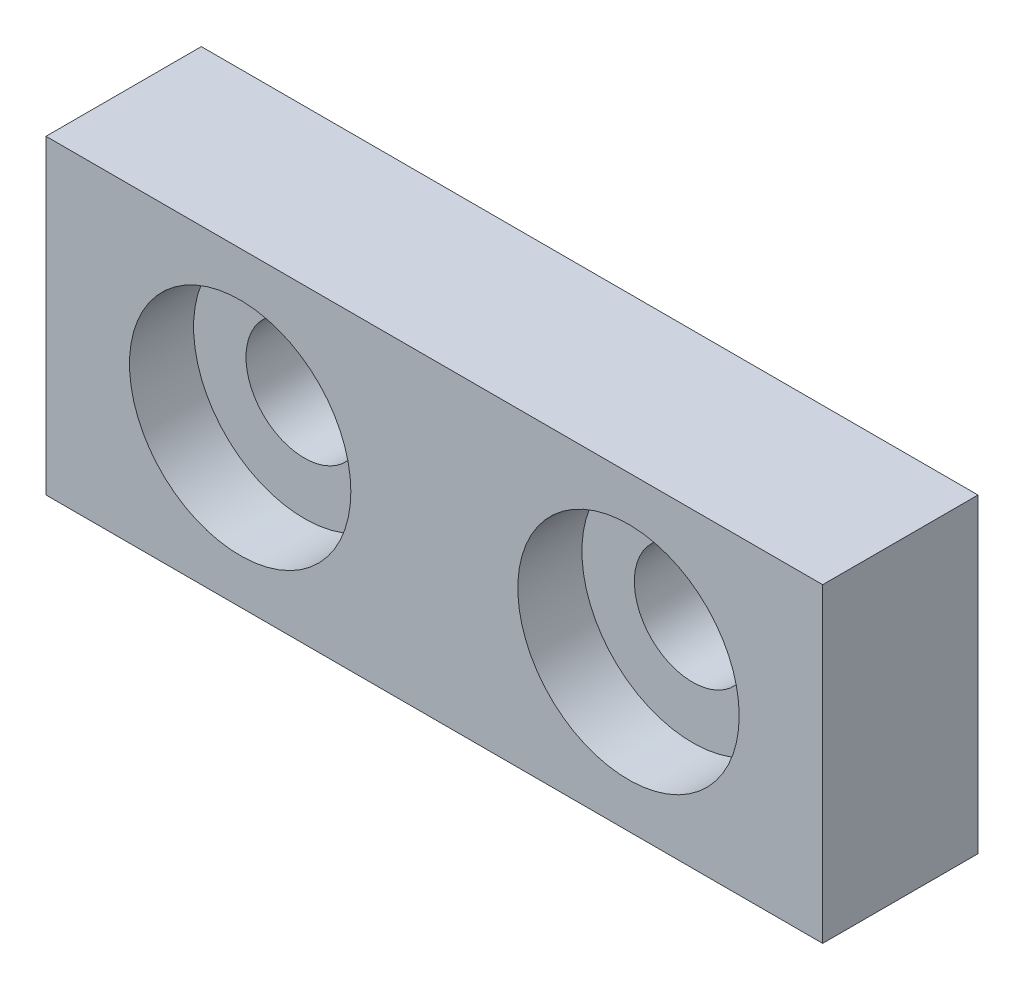
ISO-10303-21;
HEADER;
FILE_DESCRIPTION(('STEP AP214'),'2;1');
FILE_NAME('part.step','',(''),(''),'','','');
FILE_SCHEMA(('AUTOMOTIVE_DESIGN { 1 0 10303 214 1 1 1 1 }'));
ENDSEC;
DATA;
#1=APPLICATION_CONTEXT('core data for automotive mechanical design processes');
#2=APPLICATION_PROTOCOL_DEFINITION('international standard','automotive_design',2000,#1);
#3=PRODUCT_CONTEXT('',#1,'mechanical');
#4=PRODUCT('Part','Part','',(#3));
#5=PRODUCT_RELATED_PRODUCT_CATEGORY('part','',(#4));
#6=PRODUCT_DEFINITION_FORMATION('','',#4);
#7=PRODUCT_DEFINITION_CONTEXT('part definition',#1,'design');
#8=PRODUCT_DEFINITION('design','',#6,#7);
#9=PRODUCT_DEFINITION_SHAPE('','',#8);
#10=(LENGTH_UNIT() NAMED_UNIT(*) SI_UNIT(.MILLI.,.METRE.));
#11=(NAMED_UNIT(*) PLANE_ANGLE_UNIT() SI_UNIT($,.RADIAN.));
#12=(NAMED_UNIT(*) SI_UNIT($,.STERADIAN.) SOLID_ANGLE_UNIT());
#13=UNCERTAINTY_MEASURE_WITH_UNIT(LENGTH_MEASURE(1.E-05),#10,'distance_accuracy_value','');
#14=(GEOMETRIC_REPRESENTATION_CONTEXT(3) GLOBAL_UNCERTAINTY_ASSIGNED_CONTEXT((#13)) GLOBAL_UNIT_ASSIGNED_CONTEXT((#10,
#11,#12)) REPRESENTATION_CONTEXT('',''));
#15=CARTESIAN_POINT('',(0.,0.,0.));
#16=DIRECTION('',(0.,0.,1.));
#17=DIRECTION('',(1.,0.,0.));
#18=AXIS2_PLACEMENT_3D('',#15,#16,#17);
#19=CARTESIAN_POINT('',(-39.5,69.,4.));
#20=DIRECTION('',(0.,0.,-1.));
#21=DIRECTION('',(-1.,0.,0.));
#22=AXIS2_PLACEMENT_3D('',#19,#20,#21);
#23=CYLINDRICAL_SURFACE('',#22,1.5);
#24=CARTESIAN_POINT('',(-39.5,69.,0.));
#25=DIRECTION('',(0.,0.,1.));
#26=DIRECTION('',(1.,0.,0.));
#27=AXIS2_PLACEMENT_3D('',#24,#25,#26);
#28=CIRCLE('',#27,1.5);
#29=CARTESIAN_POINT('',(-38.,69.,0.));
#30=VERTEX_POINT('',#29);
#31=EDGE_CURVE('E101',#30,#30,#28,.T.);
#32=ORIENTED_EDGE('',*,*,#31,.F.);
#33=EDGE_LOOP('',(#32));
#34=FACE_BOUND('',#33,.T.);
#35=CARTESIAN_POINT('',(-39.5,69.,2.35));
#36=DIRECTION('',(0.,0.,1.));
#37=DIRECTION('',(1.,0.,0.));
#38=AXIS2_PLACEMENT_3D('',#35,#36,#37);
#39=CIRCLE('',#38,1.5);
#40=CARTESIAN_POINT('',(-38.,69.,2.35));
#41=VERTEX_POINT('',#40);
#42=EDGE_CURVE('E38',#41,#41,#39,.T.);
#43=ORIENTED_EDGE('',*,*,#42,.T.);
#44=EDGE_LOOP('',(#43));
#45=FACE_BOUND('',#44,.T.);
#46=ADVANCED_FACE('F35',(#34,#45),#23,.F.);
#47=CARTESIAN_POINT('',(-49.5,69.,4.));
#48=DIRECTION('',(0.,0.,-1.));
#49=DIRECTION('',(-1.,0.,0.));
#50=AXIS2_PLACEMENT_3D('',#47,#48,#49);
#51=CYLINDRICAL_SURFACE('',#50,1.5);
#52=CARTESIAN_POINT('',(-49.5,69.,0.));
#53=DIRECTION('',(0.,0.,1.));
#54=DIRECTION('',(1.,0.,0.));
#55=AXIS2_PLACEMENT_3D('',#52,#53,#54);
#56=CIRCLE('',#55,1.5);
#57=CARTESIAN_POINT('',(-48.,69.,0.));
#58=VERTEX_POINT('',#57);
#59=EDGE_CURVE('E112',#58,#58,#56,.T.);
#60=ORIENTED_EDGE('',*,*,#59,.F.);
#61=EDGE_LOOP('',(#60));
#62=FACE_BOUND('',#61,.T.);
#63=CARTESIAN_POINT('',(-49.5,69.,2.35));
#64=DIRECTION('',(0.,0.,1.));
#65=DIRECTION('',(1.,0.,0.));
#66=AXIS2_PLACEMENT_3D('',#63,#64,#65);
#67=CIRCLE('',#66,1.5);
#68=CARTESIAN_POINT('',(-48.,69.,2.35));
#69=VERTEX_POINT('',#68);
#70=EDGE_CURVE('E116',#69,#69,#67,.T.);
#71=ORIENTED_EDGE('',*,*,#70,.T.);
#72=EDGE_LOOP('',(#71));
#73=FACE_BOUND('',#72,.T.);
#74=ADVANCED_FACE('F160',(#62,#73),#51,.F.);
#75=CARTESIAN_POINT('',(0.,65.,4.));
#76=DIRECTION('',(0.,1.,0.));
#77=DIRECTION('',(0.,0.,1.));
#78=AXIS2_PLACEMENT_3D('',#75,#76,#77);
#79=PLANE('',#78);
#80=DIRECTION('',(1.,0.,0.));
#81=VECTOR('',#80,1.);
#82=CARTESIAN_POINT('',(0.,65.,0.));
#83=LINE('',#82,#81);
#84=CARTESIAN_POINT('',(-54.5,65.,0.));
#85=VERTEX_POINT('',#84);
#86=CARTESIAN_POINT('',(-34.5,65.,0.));
#87=VERTEX_POINT('',#86);
#88=EDGE_CURVE('E104',#85,#87,#83,.T.);
#89=ORIENTED_EDGE('',*,*,#88,.T.);
#90=DIRECTION('',(0.,0.,-1.));
#91=VECTOR('',#90,1.);
#92=CARTESIAN_POINT('',(-34.5,65.,4.));
#93=LINE('',#92,#91);
#94=CARTESIAN_POINT('',(-34.5,65.,4.));
#95=VERTEX_POINT('',#94);
#96=EDGE_CURVE('E11',#95,#87,#93,.T.);
#97=ORIENTED_EDGE('',*,*,#96,.F.);
#98=DIRECTION('',(1.,0.,0.));
#99=VECTOR('',#98,1.);
#100=CARTESIAN_POINT('',(0.,65.,4.));
#101=LINE('',#100,#99);
#102=CARTESIAN_POINT('',(-54.5,65.,4.));
#103=VERTEX_POINT('',#102);
#104=EDGE_CURVE('E86',#103,#95,#101,.T.);
#105=ORIENTED_EDGE('',*,*,#104,.F.);
#106=DIRECTION('',(0.,0.,-1.));
#107=VECTOR('',#106,1.);
#108=CARTESIAN_POINT('',(-54.5,65.,4.));
#109=LINE('',#108,#107);
#110=EDGE_CURVE('E53',#103,#85,#109,.T.);
#111=ORIENTED_EDGE('',*,*,#110,.T.);
#112=EDGE_LOOP('',(#89,#97,#105,#111));
#113=FACE_BOUND('',#112,.T.);
#114=ADVANCED_FACE('F165',(#113),#79,.F.);
#115=CARTESIAN_POINT('',(-34.5,0.,4.));
#116=DIRECTION('',(-1.,0.,0.));
#117=DIRECTION('',(0.,0.,1.));
#118=AXIS2_PLACEMENT_3D('',#115,#116,#117);
#119=PLANE('',#118);
#120=DIRECTION('',(0.,1.,0.));
#121=VECTOR('',#120,1.);
#122=CARTESIAN_POINT('',(-34.5,0.,0.));
#123=LINE('',#122,#121);
#124=CARTESIAN_POINT('',(-34.5,73.,0.));
#125=VERTEX_POINT('',#124);
#126=EDGE_CURVE('E91',#87,#125,#123,.T.);
#127=ORIENTED_EDGE('',*,*,#126,.T.);
#128=DIRECTION('',(0.,0.,-1.));
#129=VECTOR('',#128,1.);
#130=CARTESIAN_POINT('',(-34.5,73.,4.));
#131=LINE('',#130,#129);
#132=CARTESIAN_POINT('',(-34.5,73.,4.));
#133=VERTEX_POINT('',#132);
#134=EDGE_CURVE('E44',#133,#125,#131,.T.);
#135=ORIENTED_EDGE('',*,*,#134,.F.);
#136=DIRECTION('',(0.,1.,0.));
#137=VECTOR('',#136,1.);
#138=CARTESIAN_POINT('',(-34.5,0.,4.));
#139=LINE('',#138,#137);
#140=EDGE_CURVE('E78',#95,#133,#139,.T.);
#141=ORIENTED_EDGE('',*,*,#140,.F.);
#142=ORIENTED_EDGE('',*,*,#96,.T.);
#143=EDGE_LOOP('',(#127,#135,#141,#142));
#144=FACE_BOUND('',#143,.T.);
#145=ADVANCED_FACE('F90',(#144),#119,.F.);
#146=CARTESIAN_POINT('',(0.,73.,4.));
#147=DIRECTION('',(0.,1.,0.));
#148=DIRECTION('',(0.,0.,1.));
#149=AXIS2_PLACEMENT_3D('',#146,#147,#148);
#150=PLANE('',#149);
#151=DIRECTION('',(1.,0.,0.));
#152=VECTOR('',#151,1.);
#153=CARTESIAN_POINT('',(0.,73.,0.));
#154=LINE('',#153,#152);
#155=CARTESIAN_POINT('',(-54.5,73.,0.));
#156=VERTEX_POINT('',#155);
#157=EDGE_CURVE('E107',#156,#125,#154,.T.);
#158=ORIENTED_EDGE('',*,*,#157,.F.);
#159=DIRECTION('',(0.,0.,-1.));
#160=VECTOR('',#159,1.);
#161=CARTESIAN_POINT('',(-54.5,73.,4.));
#162=LINE('',#161,#160);
#163=CARTESIAN_POINT('',(-54.5,73.,4.));
#164=VERTEX_POINT('',#163);
#165=EDGE_CURVE('E67',#164,#156,#162,.T.);
#166=ORIENTED_EDGE('',*,*,#165,.F.);
#167=DIRECTION('',(1.,0.,0.));
#168=VECTOR('',#167,1.);
#169=CARTESIAN_POINT('',(0.,73.,4.));
#170=LINE('',#169,#168);
#171=EDGE_CURVE('E85',#164,#133,#170,.T.);
#172=ORIENTED_EDGE('',*,*,#171,.T.);
#173=ORIENTED_EDGE('',*,*,#134,.T.);
#174=EDGE_LOOP('',(#158,#166,#172,#173));
#175=FACE_BOUND('',#174,.T.);
#176=ADVANCED_FACE('F95',(#175),#150,.T.);
#177=CARTESIAN_POINT('',(-54.5,0.,4.));
#178=DIRECTION('',(-1.,0.,0.));
#179=DIRECTION('',(0.,0.,1.));
#180=AXIS2_PLACEMENT_3D('',#177,#178,#179);
#181=PLANE('',#180);
#182=DIRECTION('',(0.,1.,0.));
#183=VECTOR('',#182,1.);
#184=CARTESIAN_POINT('',(-54.5,0.,0.));
#185=LINE('',#184,#183);
#186=EDGE_CURVE('E109',#85,#156,#185,.T.);
#187=ORIENTED_EDGE('',*,*,#186,.F.);
#188=ORIENTED_EDGE('',*,*,#110,.F.);
#189=DIRECTION('',(0.,1.,0.));
#190=VECTOR('',#189,1.);
#191=CARTESIAN_POINT('',(-54.5,0.,4.));
#192=LINE('',#191,#190);
#193=EDGE_CURVE('E96',#103,#164,#192,.T.);
#194=ORIENTED_EDGE('',*,*,#193,.T.);
#195=ORIENTED_EDGE('',*,*,#165,.T.);
#196=EDGE_LOOP('',(#187,#188,#194,#195));
#197=FACE_BOUND('',#196,.T.);
#198=ADVANCED_FACE('F147',(#197),#181,.T.);
#199=CARTESIAN_POINT('',(0.,0.,4.));
#200=DIRECTION('',(0.,0.,1.));
#201=DIRECTION('',(1.,0.,0.));
#202=AXIS2_PLACEMENT_3D('',#199,#200,#201);
#203=PLANE('',#202);
#204=CARTESIAN_POINT('',(-39.5,69.,4.));
#205=DIRECTION('',(0.,0.,1.));
#206=DIRECTION('',(1.,0.,0.));
#207=AXIS2_PLACEMENT_3D('',#204,#205,#206);
#208=CIRCLE('',#207,2.85);
#209=CARTESIAN_POINT('',(-36.65,69.,4.));
#210=VERTEX_POINT('',#209);
#211=EDGE_CURVE('E123',#210,#210,#208,.T.);
#212=ORIENTED_EDGE('',*,*,#211,.F.);
#213=EDGE_LOOP('',(#212));
#214=FACE_BOUND('',#213,.T.);
#215=CARTESIAN_POINT('',(-49.5,69.,4.));
#216=DIRECTION('',(0.,0.,1.));
#217=DIRECTION('',(1.,0.,0.));
#218=AXIS2_PLACEMENT_3D('',#215,#216,#217);
#219=CIRCLE('',#218,2.85);
#220=CARTESIAN_POINT('',(-46.65,69.,4.));
#221=VERTEX_POINT('',#220);
#222=EDGE_CURVE('E128',#221,#221,#219,.T.);
#223=ORIENTED_EDGE('',*,*,#222,.F.);
#224=EDGE_LOOP('',(#223));
#225=FACE_BOUND('',#224,.T.);
#226=ORIENTED_EDGE('',*,*,#104,.T.);
#227=ORIENTED_EDGE('',*,*,#140,.T.);
#228=ORIENTED_EDGE('',*,*,#171,.F.);
#229=ORIENTED_EDGE('',*,*,#193,.F.);
#230=EDGE_LOOP('',(#226,#227,#228,#229));
#231=FACE_BOUND('',#230,.T.);
#232=ADVANCED_FACE('F82',(#214,#225,#231),#203,.T.);
#233=CARTESIAN_POINT('',(0.,0.,0.));
#234=DIRECTION('',(0.,0.,1.));
#235=DIRECTION('',(1.,0.,0.));
#236=AXIS2_PLACEMENT_3D('',#233,#234,#235);
#237=PLANE('',#236);
#238=ORIENTED_EDGE('',*,*,#31,.T.);
#239=EDGE_LOOP('',(#238));
#240=FACE_BOUND('',#239,.T.);
#241=ORIENTED_EDGE('',*,*,#88,.F.);
#242=ORIENTED_EDGE('',*,*,#186,.T.);
#243=ORIENTED_EDGE('',*,*,#157,.T.);
#244=ORIENTED_EDGE('',*,*,#126,.F.);
#245=EDGE_LOOP('',(#241,#242,#243,#244));
#246=FACE_BOUND('',#245,.T.);
#247=ORIENTED_EDGE('',*,*,#59,.T.);
#248=EDGE_LOOP('',(#247));
#249=FACE_BOUND('',#248,.T.);
#250=ADVANCED_FACE('F142',(#240,#246,#249),#237,.F.);
#251=CARTESIAN_POINT('',(-49.5,69.,2.35));
#252=DIRECTION('',(0.,0.,1.));
#253=DIRECTION('',(1.,0.,0.));
#254=AXIS2_PLACEMENT_3D('',#251,#252,#253);
#255=CYLINDRICAL_SURFACE('',#254,2.85);
#256=CARTESIAN_POINT('',(-49.5,69.,2.35));
#257=DIRECTION('',(0.,0.,1.));
#258=DIRECTION('',(1.,0.,0.));
#259=AXIS2_PLACEMENT_3D('',#256,#257,#258);
#260=CIRCLE('',#259,2.85);
#261=CARTESIAN_POINT('',(-46.65,69.,2.35));
#262=VERTEX_POINT('',#261);
#263=EDGE_CURVE('E133',#262,#262,#260,.T.);
#264=ORIENTED_EDGE('',*,*,#263,.F.);
#265=EDGE_LOOP('',(#264));
#266=FACE_BOUND('',#265,.T.);
#267=ORIENTED_EDGE('',*,*,#222,.T.);
#268=EDGE_LOOP('',(#267));
#269=FACE_BOUND('',#268,.T.);
#270=ADVANCED_FACE('F139',(#266,#269),#255,.F.);
#271=CARTESIAN_POINT('',(-49.5,69.,2.35));
#272=DIRECTION('',(0.,0.,1.));
#273=DIRECTION('',(1.,0.,0.));
#274=AXIS2_PLACEMENT_3D('',#271,#272,#273);
#275=PLANE('',#274);
#276=ORIENTED_EDGE('',*,*,#70,.F.);
#277=EDGE_LOOP('',(#276));
#278=FACE_BOUND('',#277,.T.);
#279=ORIENTED_EDGE('',*,*,#263,.T.);
#280=EDGE_LOOP('',(#279));
#281=FACE_BOUND('',#280,.T.);
#282=ADVANCED_FACE('F137',(#278,#281),#275,.T.);
#283=CARTESIAN_POINT('',(-39.5,69.,2.35));
#284=DIRECTION('',(0.,0.,1.));
#285=DIRECTION('',(1.,0.,0.));
#286=AXIS2_PLACEMENT_3D('',#283,#284,#285);
#287=CYLINDRICAL_SURFACE('',#286,2.85);
#288=CARTESIAN_POINT('',(-39.5,69.,2.35));
#289=DIRECTION('',(0.,0.,1.));
#290=DIRECTION('',(1.,0.,0.));
#291=AXIS2_PLACEMENT_3D('',#288,#289,#290);
#292=CIRCLE('',#291,2.85);
#293=CARTESIAN_POINT('',(-36.65,69.,2.35));
#294=VERTEX_POINT('',#293);
#295=EDGE_CURVE('E118',#294,#294,#292,.T.);
#296=ORIENTED_EDGE('',*,*,#295,.F.);
#297=EDGE_LOOP('',(#296));
#298=FACE_BOUND('',#297,.T.);
#299=ORIENTED_EDGE('',*,*,#211,.T.);
#300=EDGE_LOOP('',(#299));
#301=FACE_BOUND('',#300,.T.);
#302=ADVANCED_FACE('F174',(#298,#301),#287,.F.);
#303=CARTESIAN_POINT('',(-39.5,69.,2.35));
#304=DIRECTION('',(0.,0.,1.));
#305=DIRECTION('',(1.,0.,0.));
#306=AXIS2_PLACEMENT_3D('',#303,#304,#305);
#307=PLANE('',#306);
#308=ORIENTED_EDGE('',*,*,#42,.F.);
#309=EDGE_LOOP('',(#308));
#310=FACE_BOUND('',#309,.T.);
#311=ORIENTED_EDGE('',*,*,#295,.T.);
#312=EDGE_LOOP('',(#311));
#313=FACE_BOUND('',#312,.T.);
#314=ADVANCED_FACE('F172',(#310,#313),#307,.T.);
#315=CLOSED_SHELL('',(#46,#74,#114,#145,#176,#198,#232,#250,#270,#282,#302,#314));
#316=MANIFOLD_SOLID_BREP('B2',#315);
#317=ADVANCED_BREP_SHAPE_REPRESENTATION('',(#18,#316),#14);
#318=SHAPE_DEFINITION_REPRESENTATION(#9,#317);
ENDSEC;
END-ISO-10303-21;
